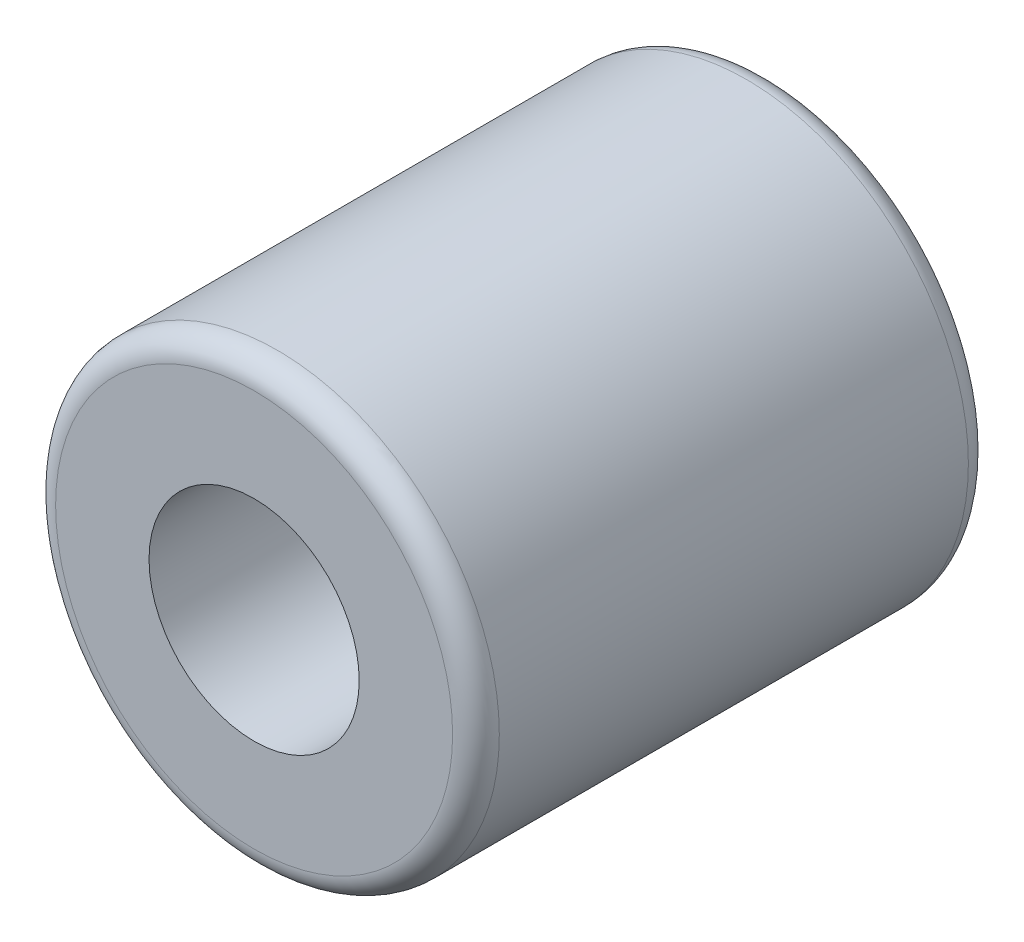
ISO-10303-21;
HEADER;
FILE_DESCRIPTION(('STEP AP214'),'2;1');
FILE_NAME('part.step','',(''),(''),'','','');
FILE_SCHEMA(('AUTOMOTIVE_DESIGN { 1 0 10303 214 1 1 1 1 }'));
ENDSEC;
DATA;
#1=APPLICATION_CONTEXT('core data for automotive mechanical design processes');
#2=APPLICATION_PROTOCOL_DEFINITION('international standard','automotive_design',2000,#1);
#3=PRODUCT_CONTEXT('',#1,'mechanical');
#4=PRODUCT('Part','Part','',(#3));
#5=PRODUCT_RELATED_PRODUCT_CATEGORY('part','',(#4));
#6=PRODUCT_DEFINITION_FORMATION('','',#4);
#7=PRODUCT_DEFINITION_CONTEXT('part definition',#1,'design');
#8=PRODUCT_DEFINITION('design','',#6,#7);
#9=PRODUCT_DEFINITION_SHAPE('','',#8);
#10=(LENGTH_UNIT() NAMED_UNIT(*) SI_UNIT(.MILLI.,.METRE.));
#11=(NAMED_UNIT(*) PLANE_ANGLE_UNIT() SI_UNIT($,.RADIAN.));
#12=(NAMED_UNIT(*) SI_UNIT($,.STERADIAN.) SOLID_ANGLE_UNIT());
#13=UNCERTAINTY_MEASURE_WITH_UNIT(LENGTH_MEASURE(1.E-05),#10,'distance_accuracy_value','');
#14=(GEOMETRIC_REPRESENTATION_CONTEXT(3) GLOBAL_UNCERTAINTY_ASSIGNED_CONTEXT((#13)) GLOBAL_UNIT_ASSIGNED_CONTEXT((#10,
#11,#12)) REPRESENTATION_CONTEXT('',''));
#15=CARTESIAN_POINT('',(0.,0.,0.));
#16=DIRECTION('',(0.,0.,1.));
#17=DIRECTION('',(1.,0.,0.));
#18=AXIS2_PLACEMENT_3D('',#15,#16,#17);
#19=CARTESIAN_POINT('',(-51.2500000000033,23.1840462387505,67.2832288425443));
#20=DIRECTION('',(0.,0.,-1.));
#21=DIRECTION('',(-1.,0.,0.));
#22=AXIS2_PLACEMENT_3D('',#19,#20,#21);
#23=CYLINDRICAL_SURFACE('',#22,4.74999999999994);
#24=CARTESIAN_POINT('',(-51.2500000000033,23.1840462387505,53.3482));
#25=DIRECTION('',(0.,0.,1.));
#26=DIRECTION('',(1.,0.,0.));
#27=AXIS2_PLACEMENT_3D('',#24,#25,#26);
#28=CIRCLE('',#27,4.74999999999994);
#29=CARTESIAN_POINT('',(-46.5000000000034,23.1840462387505,53.3482));
#30=VERTEX_POINT('',#29);
#31=EDGE_CURVE('E38',#30,#30,#28,.F.);
#32=ORIENTED_EDGE('',*,*,#31,.T.);
#33=EDGE_LOOP('',(#32));
#34=FACE_BOUND('',#33,.T.);
#35=CARTESIAN_POINT('',(-51.2500000000033,23.1840462387505,43.3049968290275));
#36=DIRECTION('',(0.,0.,1.));
#37=DIRECTION('',(1.,0.,0.));
#38=AXIS2_PLACEMENT_3D('',#35,#36,#37);
#39=CIRCLE('',#38,4.74999999999994);
#40=CARTESIAN_POINT('',(-46.5000000000034,23.1840462387505,43.3049968290275));
#41=VERTEX_POINT('',#40);
#42=EDGE_CURVE('E42',#41,#41,#39,.T.);
#43=ORIENTED_EDGE('',*,*,#42,.T.);
#44=EDGE_LOOP('',(#43));
#45=FACE_BOUND('',#44,.T.);
#46=ADVANCED_FACE('F31',(#34,#45),#23,.T.);
#47=CARTESIAN_POINT('',(-51.2500000000033,23.1840462387505,42.8049968290275));
#48=DIRECTION('',(0.,0.,1.));
#49=DIRECTION('',(1.,0.,0.));
#50=AXIS2_PLACEMENT_3D('',#47,#48,#49);
#51=PLANE('',#50);
#52=CARTESIAN_POINT('',(-51.2500000000033,23.1840462387505,42.8049968290275));
#53=DIRECTION('',(0.,0.,1.));
#54=DIRECTION('',(1.,0.,0.));
#55=AXIS2_PLACEMENT_3D('',#52,#53,#54);
#56=CIRCLE('',#55,4.24999999999994);
#57=CARTESIAN_POINT('',(-47.0000000000034,23.1840462387505,42.8049968290275));
#58=VERTEX_POINT('',#57);
#59=EDGE_CURVE('E10',#58,#58,#56,.F.);
#60=ORIENTED_EDGE('',*,*,#59,.T.);
#61=EDGE_LOOP('',(#60));
#62=FACE_BOUND('',#61,.T.);
#63=CARTESIAN_POINT('',(-51.2500000000033,23.1840462387505,42.8049968290275));
#64=DIRECTION('',(0.,0.,1.));
#65=DIRECTION('',(1.,0.,0.));
#66=AXIS2_PLACEMENT_3D('',#63,#64,#65);
#67=CIRCLE('',#66,2.24999999999995);
#68=CARTESIAN_POINT('',(-49.0000000000034,23.1840462387505,42.8049968290275));
#69=VERTEX_POINT('',#68);
#70=EDGE_CURVE('E51',#69,#69,#67,.T.);
#71=ORIENTED_EDGE('',*,*,#70,.T.);
#72=EDGE_LOOP('',(#71));
#73=FACE_BOUND('',#72,.T.);
#74=ADVANCED_FACE('F58',(#62,#73),#51,.F.);
#75=CARTESIAN_POINT('',(-51.2500000000033,23.1840462387505,67.2832288425443));
#76=DIRECTION('',(0.,0.,-1.));
#77=DIRECTION('',(-1.,0.,0.));
#78=AXIS2_PLACEMENT_3D('',#75,#76,#77);
#79=CYLINDRICAL_SURFACE('',#78,2.24999999999995);
#80=ORIENTED_EDGE('',*,*,#70,.F.);
#81=EDGE_LOOP('',(#80));
#82=FACE_BOUND('',#81,.T.);
#83=CARTESIAN_POINT('',(-51.2500000000033,23.1840462387505,53.8482));
#84=DIRECTION('',(0.,0.,1.));
#85=DIRECTION('',(1.,0.,0.));
#86=AXIS2_PLACEMENT_3D('',#83,#84,#85);
#87=CIRCLE('',#86,2.24999999999995);
#88=CARTESIAN_POINT('',(-49.0000000000034,23.1840462387505,53.8482));
#89=VERTEX_POINT('',#88);
#90=EDGE_CURVE('E52',#89,#89,#87,.T.);
#91=ORIENTED_EDGE('',*,*,#90,.T.);
#92=EDGE_LOOP('',(#91));
#93=FACE_BOUND('',#92,.T.);
#94=ADVANCED_FACE('F60',(#82,#93),#79,.F.);
#95=CARTESIAN_POINT('',(-51.2500000000033,23.1840462387506,53.8482));
#96=DIRECTION('',(0.,0.,1.));
#97=DIRECTION('',(1.,0.,0.));
#98=AXIS2_PLACEMENT_3D('',#95,#96,#97);
#99=PLANE('',#98);
#100=CARTESIAN_POINT('',(-51.2500000000033,23.1840462387505,53.8482));
#101=DIRECTION('',(0.,0.,1.));
#102=DIRECTION('',(1.,0.,0.));
#103=AXIS2_PLACEMENT_3D('',#100,#101,#102);
#104=CIRCLE('',#103,4.24999999999994);
#105=CARTESIAN_POINT('',(-47.0000000000034,23.1840462387505,53.8482));
#106=VERTEX_POINT('',#105);
#107=EDGE_CURVE('E46',#106,#106,#104,.T.);
#108=ORIENTED_EDGE('',*,*,#107,.T.);
#109=EDGE_LOOP('',(#108));
#110=FACE_BOUND('',#109,.T.);
#111=ORIENTED_EDGE('',*,*,#90,.F.);
#112=EDGE_LOOP('',(#111));
#113=FACE_BOUND('',#112,.T.);
#114=ADVANCED_FACE('F63',(#110,#113),#99,.T.);
#115=CARTESIAN_POINT('',(-51.2500000000033,23.1840462387505,53.3482));
#116=DIRECTION('',(0.,0.,1.));
#117=DIRECTION('',(1.,0.,0.));
#118=AXIS2_PLACEMENT_3D('',#115,#116,#117);
#119=TOROIDAL_SURFACE('',#118,4.24999999999994,0.5);
#120=ORIENTED_EDGE('',*,*,#31,.F.);
#121=EDGE_LOOP('',(#120));
#122=FACE_BOUND('',#121,.T.);
#123=ORIENTED_EDGE('',*,*,#107,.F.);
#124=EDGE_LOOP('',(#123));
#125=FACE_BOUND('',#124,.T.);
#126=ADVANCED_FACE('F68',(#122,#125),#119,.T.);
#127=CARTESIAN_POINT('',(-51.2500000000033,23.1840462387505,43.3049968290275));
#128=DIRECTION('',(0.,0.,1.));
#129=DIRECTION('',(1.,0.,0.));
#130=AXIS2_PLACEMENT_3D('',#127,#128,#129);
#131=TOROIDAL_SURFACE('',#130,4.24999999999994,0.5);
#132=ORIENTED_EDGE('',*,*,#59,.F.);
#133=EDGE_LOOP('',(#132));
#134=FACE_BOUND('',#133,.T.);
#135=ORIENTED_EDGE('',*,*,#42,.F.);
#136=EDGE_LOOP('',(#135));
#137=FACE_BOUND('',#136,.T.);
#138=ADVANCED_FACE('F33',(#134,#137),#131,.T.);
#139=CLOSED_SHELL('',(#46,#74,#94,#114,#126,#138));
#140=MANIFOLD_SOLID_BREP('B2',#139);
#141=ADVANCED_BREP_SHAPE_REPRESENTATION('',(#18,#140),#14);
#142=SHAPE_DEFINITION_REPRESENTATION(#9,#141);
ENDSEC;
END-ISO-10303-21;
